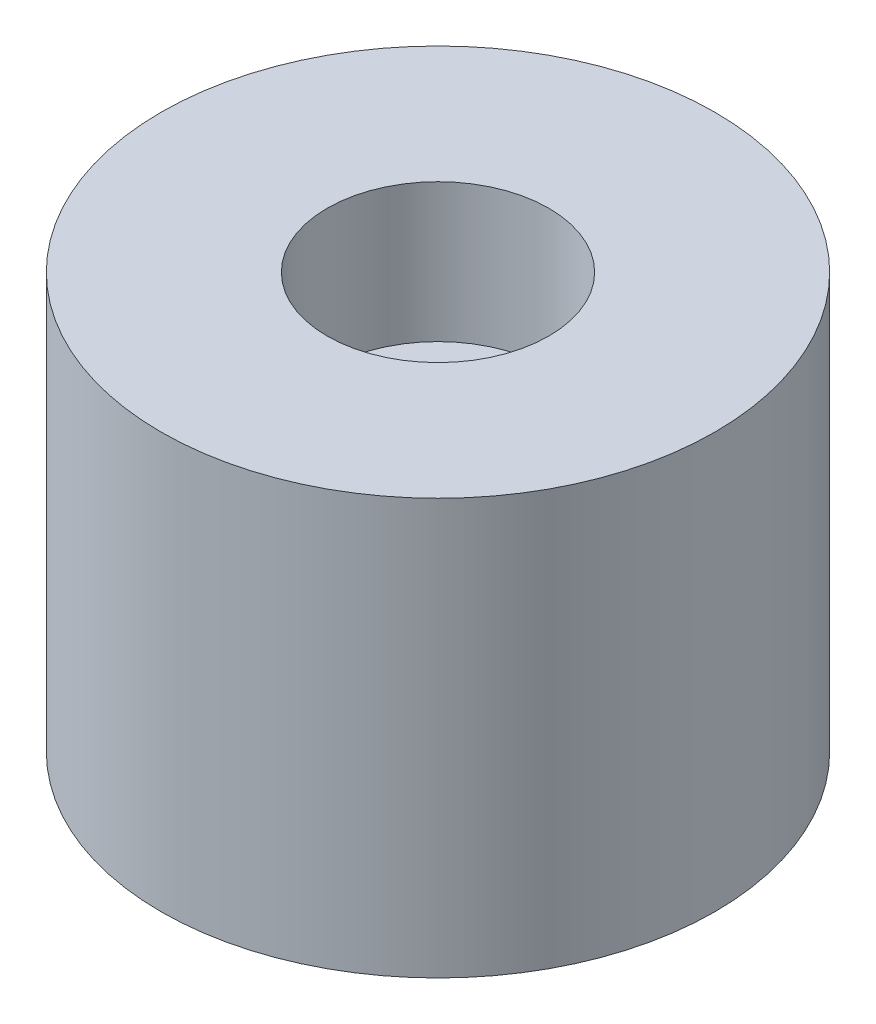
ISO-10303-21;
HEADER;
FILE_DESCRIPTION(('STEP AP214'),'2;1');
FILE_NAME('part.step','',(''),(''),'','','');
FILE_SCHEMA(('AUTOMOTIVE_DESIGN { 1 0 10303 214 1 1 1 1 }'));
ENDSEC;
DATA;
#1=APPLICATION_CONTEXT('core data for automotive mechanical design processes');
#2=APPLICATION_PROTOCOL_DEFINITION('international standard','automotive_design',2000,#1);
#3=PRODUCT_CONTEXT('',#1,'mechanical');
#4=PRODUCT('Part','Part','',(#3));
#5=PRODUCT_RELATED_PRODUCT_CATEGORY('part','',(#4));
#6=PRODUCT_DEFINITION_FORMATION('','',#4);
#7=PRODUCT_DEFINITION_CONTEXT('part definition',#1,'design');
#8=PRODUCT_DEFINITION('design','',#6,#7);
#9=PRODUCT_DEFINITION_SHAPE('','',#8);
#10=(LENGTH_UNIT() NAMED_UNIT(*) SI_UNIT(.MILLI.,.METRE.));
#11=(NAMED_UNIT(*) PLANE_ANGLE_UNIT() SI_UNIT($,.RADIAN.));
#12=(NAMED_UNIT(*) SI_UNIT($,.STERADIAN.) SOLID_ANGLE_UNIT());
#13=UNCERTAINTY_MEASURE_WITH_UNIT(LENGTH_MEASURE(1.E-05),#10,'distance_accuracy_value','');
#14=(GEOMETRIC_REPRESENTATION_CONTEXT(3) GLOBAL_UNCERTAINTY_ASSIGNED_CONTEXT((#13)) GLOBAL_UNIT_ASSIGNED_CONTEXT((#10,
#11,#12)) REPRESENTATION_CONTEXT('',''));
#15=CARTESIAN_POINT('',(0.,0.,0.));
#16=DIRECTION('',(0.,0.,1.));
#17=DIRECTION('',(1.,0.,0.));
#18=AXIS2_PLACEMENT_3D('',#15,#16,#17);
#19=CARTESIAN_POINT('',(0.,15.,0.));
#20=DIRECTION('',(0.,-1.,0.));
#21=DIRECTION('',(0.,0.,-1.));
#22=AXIS2_PLACEMENT_3D('',#19,#20,#21);
#23=CYLINDRICAL_SURFACE('',#22,10.);
#24=CARTESIAN_POINT('',(0.,15.,0.));
#25=DIRECTION('',(0.,1.,0.));
#26=DIRECTION('',(0.,0.,1.));
#27=AXIS2_PLACEMENT_3D('',#24,#25,#26);
#28=CIRCLE('',#27,10.);
#29=CARTESIAN_POINT('',(0.,15.,10.));
#30=VERTEX_POINT('',#29);
#31=EDGE_CURVE('E10',#30,#30,#28,.T.);
#32=ORIENTED_EDGE('',*,*,#31,.F.);
#33=EDGE_LOOP('',(#32));
#34=FACE_BOUND('',#33,.T.);
#35=CARTESIAN_POINT('',(0.,0.,0.));
#36=DIRECTION('',(0.,1.,0.));
#37=DIRECTION('',(0.,0.,1.));
#38=AXIS2_PLACEMENT_3D('',#35,#36,#37);
#39=CIRCLE('',#38,10.);
#40=CARTESIAN_POINT('',(0.,0.,10.));
#41=VERTEX_POINT('',#40);
#42=EDGE_CURVE('E40',#41,#41,#39,.T.);
#43=ORIENTED_EDGE('',*,*,#42,.T.);
#44=EDGE_LOOP('',(#43));
#45=FACE_BOUND('',#44,.T.);
#46=ADVANCED_FACE('F37',(#34,#45),#23,.T.);
#47=CARTESIAN_POINT('',(0.,15.,0.));
#48=DIRECTION('',(0.,1.,0.));
#49=DIRECTION('',(0.,0.,1.));
#50=AXIS2_PLACEMENT_3D('',#47,#48,#49);
#51=PLANE('',#50);
#52=CARTESIAN_POINT('',(0.,15.,0.));
#53=DIRECTION('',(0.,1.,0.));
#54=DIRECTION('',(0.,0.,1.));
#55=AXIS2_PLACEMENT_3D('',#52,#53,#54);
#56=CIRCLE('',#55,4.);
#57=CARTESIAN_POINT('',(0.,15.,4.));
#58=VERTEX_POINT('',#57);
#59=EDGE_CURVE('E51',#58,#58,#56,.T.);
#60=ORIENTED_EDGE('',*,*,#59,.F.);
#61=EDGE_LOOP('',(#60));
#62=FACE_BOUND('',#61,.T.);
#63=ORIENTED_EDGE('',*,*,#31,.T.);
#64=EDGE_LOOP('',(#63));
#65=FACE_BOUND('',#64,.T.);
#66=ADVANCED_FACE('F68',(#62,#65),#51,.T.);
#67=CARTESIAN_POINT('',(0.,0.,0.));
#68=DIRECTION('',(0.,1.,0.));
#69=DIRECTION('',(0.,0.,1.));
#70=AXIS2_PLACEMENT_3D('',#67,#68,#69);
#71=PLANE('',#70);
#72=ORIENTED_EDGE('',*,*,#42,.F.);
#73=EDGE_LOOP('',(#72));
#74=FACE_BOUND('',#73,.T.);
#75=ADVANCED_FACE('F64',(#74),#71,.F.);
#76=CARTESIAN_POINT('',(0.,10.,0.));
#77=DIRECTION('',(0.,1.,0.));
#78=DIRECTION('',(0.,0.,1.));
#79=AXIS2_PLACEMENT_3D('',#76,#77,#78);
#80=CYLINDRICAL_SURFACE('',#79,4.);
#81=CARTESIAN_POINT('',(0.,10.,0.));
#82=DIRECTION('',(0.,1.,0.));
#83=DIRECTION('',(0.,0.,1.));
#84=AXIS2_PLACEMENT_3D('',#81,#82,#83);
#85=CIRCLE('',#84,4.);
#86=CARTESIAN_POINT('',(0.,10.,4.));
#87=VERTEX_POINT('',#86);
#88=EDGE_CURVE('E49',#87,#87,#85,.T.);
#89=ORIENTED_EDGE('',*,*,#88,.F.);
#90=EDGE_LOOP('',(#89));
#91=FACE_BOUND('',#90,.T.);
#92=ORIENTED_EDGE('',*,*,#59,.T.);
#93=EDGE_LOOP('',(#92));
#94=FACE_BOUND('',#93,.T.);
#95=ADVANCED_FACE('F61',(#91,#94),#80,.F.);
#96=CARTESIAN_POINT('',(0.,10.,0.));
#97=DIRECTION('',(0.,1.,0.));
#98=DIRECTION('',(0.,0.,1.));
#99=AXIS2_PLACEMENT_3D('',#96,#97,#98);
#100=PLANE('',#99);
#101=ORIENTED_EDGE('',*,*,#88,.T.);
#102=EDGE_LOOP('',(#101));
#103=FACE_BOUND('',#102,.T.);
#104=ADVANCED_FACE('F59',(#103),#100,.T.);
#105=CLOSED_SHELL('',(#46,#66,#75,#95,#104));
#106=MANIFOLD_SOLID_BREP('B2',#105);
#107=ADVANCED_BREP_SHAPE_REPRESENTATION('',(#18,#106),#14);
#108=SHAPE_DEFINITION_REPRESENTATION(#9,#107);
ENDSEC;
END-ISO-10303-21;
